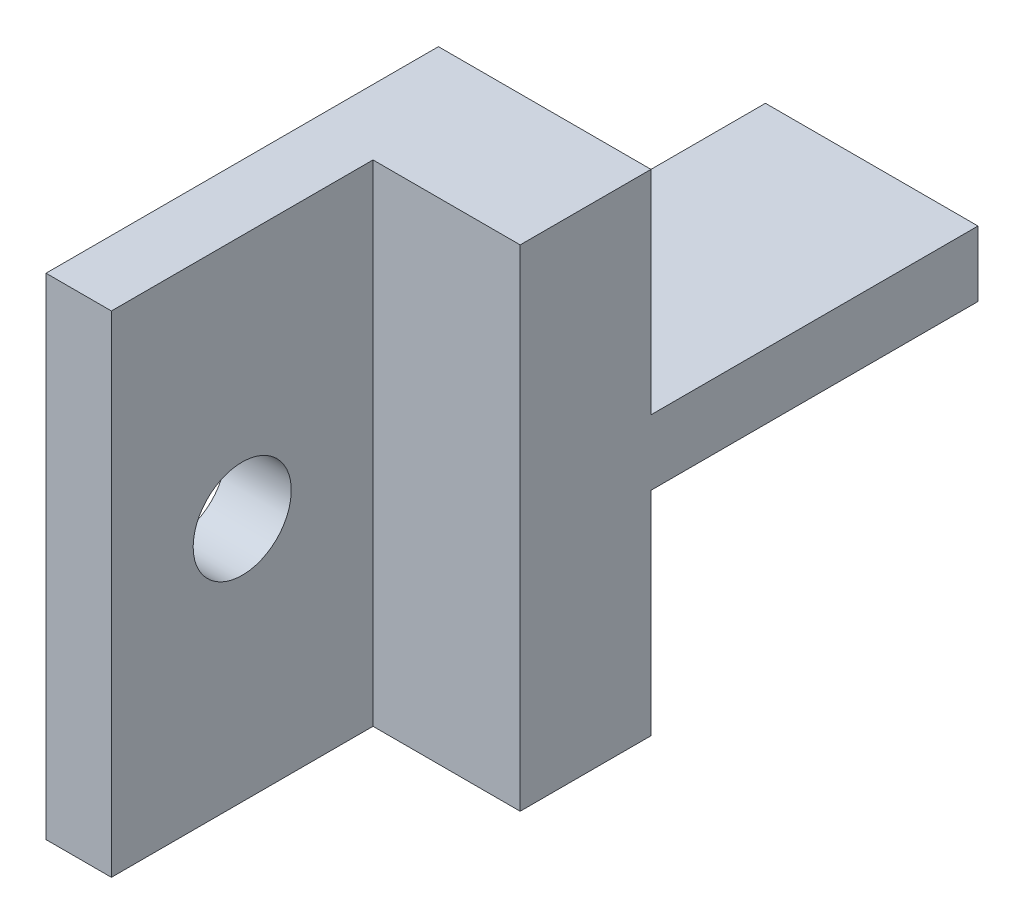
ISO-10303-21;
HEADER;
FILE_DESCRIPTION(('STEP AP214'),'2;1');
FILE_NAME('part.step','',(''),(''),'','','');
FILE_SCHEMA(('AUTOMOTIVE_DESIGN { 1 0 10303 214 1 1 1 1 }'));
ENDSEC;
DATA;
#1=APPLICATION_CONTEXT('core data for automotive mechanical design processes');
#2=APPLICATION_PROTOCOL_DEFINITION('international standard','automotive_design',2000,#1);
#3=PRODUCT_CONTEXT('',#1,'mechanical');
#4=PRODUCT('Part','Part','',(#3));
#5=PRODUCT_RELATED_PRODUCT_CATEGORY('part','',(#4));
#6=PRODUCT_DEFINITION_FORMATION('','',#4);
#7=PRODUCT_DEFINITION_CONTEXT('part definition',#1,'design');
#8=PRODUCT_DEFINITION('design','',#6,#7);
#9=PRODUCT_DEFINITION_SHAPE('','',#8);
#10=(LENGTH_UNIT() NAMED_UNIT(*) SI_UNIT(.MILLI.,.METRE.));
#11=(NAMED_UNIT(*) PLANE_ANGLE_UNIT() SI_UNIT($,.RADIAN.));
#12=(NAMED_UNIT(*) SI_UNIT($,.STERADIAN.) SOLID_ANGLE_UNIT());
#13=UNCERTAINTY_MEASURE_WITH_UNIT(LENGTH_MEASURE(1.E-05),#10,'distance_accuracy_value','');
#14=(GEOMETRIC_REPRESENTATION_CONTEXT(3) GLOBAL_UNCERTAINTY_ASSIGNED_CONTEXT((#13)) GLOBAL_UNIT_ASSIGNED_CONTEXT((#10,
#11,#12)) REPRESENTATION_CONTEXT('',''));
#15=CARTESIAN_POINT('',(0.,0.,0.));
#16=DIRECTION('',(0.,0.,1.));
#17=DIRECTION('',(1.,0.,0.));
#18=AXIS2_PLACEMENT_3D('',#15,#16,#17);
#19=CARTESIAN_POINT('',(0.,0.,-34.));
#20=DIRECTION('',(0.,0.,1.));
#21=DIRECTION('',(1.,0.,0.));
#22=AXIS2_PLACEMENT_3D('',#19,#20,#21);
#23=PLANE('',#22);
#24=DIRECTION('',(1.,0.,0.));
#25=VECTOR('',#24,1.);
#26=CARTESIAN_POINT('',(6.5,8.5,-34.));
#27=LINE('',#26,#25);
#28=CARTESIAN_POINT('',(0.,8.5,-34.));
#29=VERTEX_POINT('',#28);
#30=CARTESIAN_POINT('',(6.5,8.5,-34.));
#31=VERTEX_POINT('',#30);
#32=EDGE_CURVE('E170',#29,#31,#27,.T.);
#33=ORIENTED_EDGE('',*,*,#32,.F.);
#34=DIRECTION('',(0.,1.,0.));
#35=VECTOR('',#34,1.);
#36=CARTESIAN_POINT('',(0.,15.,-34.));
#37=LINE('',#36,#35);
#38=CARTESIAN_POINT('',(0.,15.,-34.));
#39=VERTEX_POINT('',#38);
#40=EDGE_CURVE('E146',#29,#39,#37,.T.);
#41=ORIENTED_EDGE('',*,*,#40,.T.);
#42=DIRECTION('',(1.,0.,0.));
#43=VECTOR('',#42,1.);
#44=CARTESIAN_POINT('',(0.,15.,-34.));
#45=LINE('',#44,#43);
#46=CARTESIAN_POINT('',(6.5,15.,-34.));
#47=VERTEX_POINT('',#46);
#48=EDGE_CURVE('E156',#39,#47,#45,.T.);
#49=ORIENTED_EDGE('',*,*,#48,.T.);
#50=DIRECTION('',(0.,-1.,0.));
#51=VECTOR('',#50,1.);
#52=CARTESIAN_POINT('',(6.5,15.,-34.));
#53=LINE('',#52,#51);
#54=EDGE_CURVE('E153',#47,#31,#53,.T.);
#55=ORIENTED_EDGE('',*,*,#54,.T.);
#56=EDGE_LOOP('',(#33,#41,#49,#55));
#57=FACE_BOUND('',#56,.T.);
#58=ADVANCED_FACE('F33',(#57),#23,.F.);
#59=DIRECTION('',(-1.,0.,0.));
#60=VECTOR('',#59,1.);
#61=CARTESIAN_POINT('',(6.5,6.5,-34.));
#62=LINE('',#61,#60);
#63=CARTESIAN_POINT('',(6.5,6.5,-34.));
#64=VERTEX_POINT('',#63);
#65=CARTESIAN_POINT('',(0.,6.5,-34.));
#66=VERTEX_POINT('',#65);
#67=EDGE_CURVE('E58',#64,#66,#62,.T.);
#68=ORIENTED_EDGE('',*,*,#67,.F.);
#69=CARTESIAN_POINT('',(6.5,0.,-34.));
#70=VERTEX_POINT('',#69);
#71=EDGE_CURVE('E155',#64,#70,#53,.T.);
#72=ORIENTED_EDGE('',*,*,#71,.T.);
#73=DIRECTION('',(-1.,0.,0.));
#74=VECTOR('',#73,1.);
#75=CARTESIAN_POINT('',(0.,0.,-34.));
#76=LINE('',#75,#74);
#77=CARTESIAN_POINT('',(0.,0.,-34.));
#78=VERTEX_POINT('',#77);
#79=EDGE_CURVE('E143',#70,#78,#76,.T.);
#80=ORIENTED_EDGE('',*,*,#79,.T.);
#81=EDGE_CURVE('E132',#78,#66,#37,.T.);
#82=ORIENTED_EDGE('',*,*,#81,.T.);
#83=EDGE_LOOP('',(#68,#72,#80,#82));
#84=FACE_BOUND('',#83,.T.);
#85=ADVANCED_FACE('F209',(#84),#23,.F.);
#86=CARTESIAN_POINT('',(2.,0.,0.));
#87=DIRECTION('',(0.,1.,0.));
#88=DIRECTION('',(0.,0.,1.));
#89=AXIS2_PLACEMENT_3D('',#86,#87,#88);
#90=PLANE('',#89);
#91=DIRECTION('',(0.,0.,-1.));
#92=VECTOR('',#91,1.);
#93=CARTESIAN_POINT('',(2.,0.,0.));
#94=LINE('',#93,#92);
#95=CARTESIAN_POINT('',(2.,0.,-22.));
#96=VERTEX_POINT('',#95);
#97=CARTESIAN_POINT('',(2.,0.,-30.));
#98=VERTEX_POINT('',#97);
#99=EDGE_CURVE('E126',#96,#98,#94,.T.);
#100=ORIENTED_EDGE('',*,*,#99,.F.);
#101=DIRECTION('',(-1.,0.,0.));
#102=VECTOR('',#101,1.);
#103=CARTESIAN_POINT('',(10.,0.,-22.));
#104=LINE('',#103,#102);
#105=CARTESIAN_POINT('',(0.,0.,-22.));
#106=VERTEX_POINT('',#105);
#107=EDGE_CURVE('E112',#96,#106,#104,.T.);
#108=ORIENTED_EDGE('',*,*,#107,.T.);
#109=DIRECTION('',(0.,0.,-1.));
#110=VECTOR('',#109,1.);
#111=CARTESIAN_POINT('',(0.,0.,0.));
#112=LINE('',#111,#110);
#113=EDGE_CURVE('E123',#106,#78,#112,.T.);
#114=ORIENTED_EDGE('',*,*,#113,.T.);
#115=ORIENTED_EDGE('',*,*,#79,.F.);
#116=DIRECTION('',(0.,0.,1.));
#117=VECTOR('',#116,1.);
#118=CARTESIAN_POINT('',(6.5,0.,-34.));
#119=LINE('',#118,#117);
#120=CARTESIAN_POINT('',(6.5,0.,-30.));
#121=VERTEX_POINT('',#120);
#122=EDGE_CURVE('E135',#70,#121,#119,.T.);
#123=ORIENTED_EDGE('',*,*,#122,.T.);
#124=DIRECTION('',(-1.,0.,0.));
#125=VECTOR('',#124,1.);
#126=CARTESIAN_POINT('',(0.,0.,-30.));
#127=LINE('',#126,#125);
#128=EDGE_CURVE('E144',#121,#98,#127,.T.);
#129=ORIENTED_EDGE('',*,*,#128,.T.);
#130=EDGE_LOOP('',(#100,#108,#114,#115,#123,#129));
#131=FACE_BOUND('',#130,.T.);
#132=ADVANCED_FACE('F35',(#131),#90,.F.);
#133=CARTESIAN_POINT('',(2.,15.,0.));
#134=DIRECTION('',(0.,-1.,0.));
#135=DIRECTION('',(0.,0.,-1.));
#136=AXIS2_PLACEMENT_3D('',#133,#134,#135);
#137=PLANE('',#136);
#138=DIRECTION('',(0.,0.,1.));
#139=VECTOR('',#138,1.);
#140=CARTESIAN_POINT('',(0.,15.,0.));
#141=LINE('',#140,#139);
#142=CARTESIAN_POINT('',(0.,15.,-22.));
#143=VERTEX_POINT('',#142);
#144=EDGE_CURVE('E37',#39,#143,#141,.T.);
#145=ORIENTED_EDGE('',*,*,#144,.T.);
#146=DIRECTION('',(-1.,0.,0.));
#147=VECTOR('',#146,1.);
#148=CARTESIAN_POINT('',(10.,15.,-22.));
#149=LINE('',#148,#147);
#150=CARTESIAN_POINT('',(2.,15.,-22.));
#151=VERTEX_POINT('',#150);
#152=EDGE_CURVE('E50',#151,#143,#149,.T.);
#153=ORIENTED_EDGE('',*,*,#152,.F.);
#154=DIRECTION('',(0.,0.,1.));
#155=VECTOR('',#154,1.);
#156=CARTESIAN_POINT('',(2.,15.,0.));
#157=LINE('',#156,#155);
#158=CARTESIAN_POINT('',(2.,15.,-30.));
#159=VERTEX_POINT('',#158);
#160=EDGE_CURVE('E11',#159,#151,#157,.T.);
#161=ORIENTED_EDGE('',*,*,#160,.F.);
#162=DIRECTION('',(1.,0.,0.));
#163=VECTOR('',#162,1.);
#164=CARTESIAN_POINT('',(0.,15.,-30.));
#165=LINE('',#164,#163);
#166=CARTESIAN_POINT('',(6.5,15.,-30.));
#167=VERTEX_POINT('',#166);
#168=EDGE_CURVE('E149',#159,#167,#165,.T.);
#169=ORIENTED_EDGE('',*,*,#168,.T.);
#170=DIRECTION('',(0.,0.,1.));
#171=VECTOR('',#170,1.);
#172=CARTESIAN_POINT('',(6.5,15.,-34.));
#173=LINE('',#172,#171);
#174=EDGE_CURVE('E133',#47,#167,#173,.T.);
#175=ORIENTED_EDGE('',*,*,#174,.F.);
#176=ORIENTED_EDGE('',*,*,#48,.F.);
#177=EDGE_LOOP('',(#145,#153,#161,#169,#175,#176));
#178=FACE_BOUND('',#177,.T.);
#179=ADVANCED_FACE('F205',(#178),#137,.F.);
#180=CARTESIAN_POINT('',(2.,0.,0.));
#181=DIRECTION('',(-1.,0.,0.));
#182=DIRECTION('',(0.,0.,1.));
#183=AXIS2_PLACEMENT_3D('',#180,#181,#182);
#184=PLANE('',#183);
#185=CARTESIAN_POINT('',(2.,7.5,-26.));
#186=DIRECTION('',(-1.,0.,0.));
#187=DIRECTION('',(0.,0.,1.));
#188=AXIS2_PLACEMENT_3D('',#185,#186,#187);
#189=CIRCLE('',#188,1.5);
#190=CARTESIAN_POINT('',(2.,7.5,-24.5));
#191=VERTEX_POINT('',#190);
#192=EDGE_CURVE('E118',#191,#191,#189,.T.);
#193=ORIENTED_EDGE('',*,*,#192,.T.);
#194=EDGE_LOOP('',(#193));
#195=FACE_BOUND('',#194,.T.);
#196=ORIENTED_EDGE('',*,*,#160,.T.);
#197=DIRECTION('',(0.,-1.,0.));
#198=VECTOR('',#197,1.);
#199=CARTESIAN_POINT('',(2.,0.,-22.));
#200=LINE('',#199,#198);
#201=EDGE_CURVE('E127',#151,#96,#200,.T.);
#202=ORIENTED_EDGE('',*,*,#201,.T.);
#203=ORIENTED_EDGE('',*,*,#99,.T.);
#204=DIRECTION('',(0.,1.,0.));
#205=VECTOR('',#204,1.);
#206=CARTESIAN_POINT('',(2.,0.,-30.));
#207=LINE('',#206,#205);
#208=EDGE_CURVE('E42',#98,#159,#207,.T.);
#209=ORIENTED_EDGE('',*,*,#208,.T.);
#210=EDGE_LOOP('',(#196,#202,#203,#209));
#211=FACE_BOUND('',#210,.T.);
#212=ADVANCED_FACE('F195',(#195,#211),#184,.F.);
#213=CARTESIAN_POINT('',(0.,0.,0.));
#214=DIRECTION('',(-1.,0.,0.));
#215=DIRECTION('',(0.,0.,1.));
#216=AXIS2_PLACEMENT_3D('',#213,#214,#215);
#217=PLANE('',#216);
#218=CARTESIAN_POINT('',(0.,7.5,-26.));
#219=DIRECTION('',(-1.,0.,0.));
#220=DIRECTION('',(0.,0.,1.));
#221=AXIS2_PLACEMENT_3D('',#218,#219,#220);
#222=CIRCLE('',#221,1.5);
#223=CARTESIAN_POINT('',(0.,7.5,-24.5));
#224=VERTEX_POINT('',#223);
#225=EDGE_CURVE('E186',#224,#224,#222,.T.);
#226=ORIENTED_EDGE('',*,*,#225,.F.);
#227=EDGE_LOOP('',(#226));
#228=FACE_BOUND('',#227,.T.);
#229=DIRECTION('',(0.,-1.,0.));
#230=VECTOR('',#229,1.);
#231=CARTESIAN_POINT('',(0.,15.,-22.));
#232=LINE('',#231,#230);
#233=EDGE_CURVE('E109',#143,#106,#232,.T.);
#234=ORIENTED_EDGE('',*,*,#233,.F.);
#235=ORIENTED_EDGE('',*,*,#144,.F.);
#236=ORIENTED_EDGE('',*,*,#40,.F.);
#237=DIRECTION('',(0.,0.,1.));
#238=VECTOR('',#237,1.);
#239=CARTESIAN_POINT('',(0.,8.5,-44.));
#240=LINE('',#239,#238);
#241=CARTESIAN_POINT('',(0.,8.5,-44.));
#242=VERTEX_POINT('',#241);
#243=EDGE_CURVE('E163',#242,#29,#240,.T.);
#244=ORIENTED_EDGE('',*,*,#243,.F.);
#245=DIRECTION('',(0.,1.,0.));
#246=VECTOR('',#245,1.);
#247=CARTESIAN_POINT('',(0.,8.5,-44.));
#248=LINE('',#247,#246);
#249=CARTESIAN_POINT('',(0.,6.5,-44.));
#250=VERTEX_POINT('',#249);
#251=EDGE_CURVE('E176',#250,#242,#248,.T.);
#252=ORIENTED_EDGE('',*,*,#251,.F.);
#253=DIRECTION('',(0.,0.,1.));
#254=VECTOR('',#253,1.);
#255=CARTESIAN_POINT('',(0.,6.5,-44.));
#256=LINE('',#255,#254);
#257=EDGE_CURVE('E161',#250,#66,#256,.T.);
#258=ORIENTED_EDGE('',*,*,#257,.T.);
#259=ORIENTED_EDGE('',*,*,#81,.F.);
#260=ORIENTED_EDGE('',*,*,#113,.F.);
#261=EDGE_LOOP('',(#234,#235,#236,#244,#252,#258,#259,#260));
#262=FACE_BOUND('',#261,.T.);
#263=ADVANCED_FACE('F130',(#228,#262),#217,.T.);
#264=CARTESIAN_POINT('',(0.,0.,-30.));
#265=DIRECTION('',(0.,0.,1.));
#266=DIRECTION('',(1.,0.,0.));
#267=AXIS2_PLACEMENT_3D('',#264,#265,#266);
#268=PLANE('',#267);
#269=ORIENTED_EDGE('',*,*,#208,.F.);
#270=ORIENTED_EDGE('',*,*,#128,.F.);
#271=DIRECTION('',(0.,-1.,0.));
#272=VECTOR('',#271,1.);
#273=CARTESIAN_POINT('',(6.5,15.,-30.));
#274=LINE('',#273,#272);
#275=EDGE_CURVE('E147',#167,#121,#274,.T.);
#276=ORIENTED_EDGE('',*,*,#275,.F.);
#277=ORIENTED_EDGE('',*,*,#168,.F.);
#278=EDGE_LOOP('',(#269,#270,#276,#277));
#279=FACE_BOUND('',#278,.T.);
#280=ADVANCED_FACE('F194',(#279),#268,.T.);
#281=CARTESIAN_POINT('',(6.5,15.,-34.));
#282=DIRECTION('',(-1.,0.,0.));
#283=DIRECTION('',(0.,-1.,0.));
#284=AXIS2_PLACEMENT_3D('',#281,#282,#283);
#285=PLANE('',#284);
#286=ORIENTED_EDGE('',*,*,#275,.T.);
#287=ORIENTED_EDGE('',*,*,#122,.F.);
#288=ORIENTED_EDGE('',*,*,#71,.F.);
#289=DIRECTION('',(0.,0.,1.));
#290=VECTOR('',#289,1.);
#291=CARTESIAN_POINT('',(6.5,6.5,-44.));
#292=LINE('',#291,#290);
#293=CARTESIAN_POINT('',(6.5,6.5,-44.));
#294=VERTEX_POINT('',#293);
#295=EDGE_CURVE('E151',#294,#64,#292,.T.);
#296=ORIENTED_EDGE('',*,*,#295,.F.);
#297=DIRECTION('',(0.,-1.,0.));
#298=VECTOR('',#297,1.);
#299=CARTESIAN_POINT('',(6.5,8.5,-44.));
#300=LINE('',#299,#298);
#301=CARTESIAN_POINT('',(6.5,8.5,-44.));
#302=VERTEX_POINT('',#301);
#303=EDGE_CURVE('E173',#302,#294,#300,.T.);
#304=ORIENTED_EDGE('',*,*,#303,.F.);
#305=DIRECTION('',(0.,0.,1.));
#306=VECTOR('',#305,1.);
#307=CARTESIAN_POINT('',(6.5,8.5,-44.));
#308=LINE('',#307,#306);
#309=EDGE_CURVE('E166',#302,#31,#308,.T.);
#310=ORIENTED_EDGE('',*,*,#309,.T.);
#311=ORIENTED_EDGE('',*,*,#54,.F.);
#312=ORIENTED_EDGE('',*,*,#174,.T.);
#313=EDGE_LOOP('',(#286,#287,#288,#296,#304,#310,#311,#312));
#314=FACE_BOUND('',#313,.T.);
#315=ADVANCED_FACE('F202',(#314),#285,.F.);
#316=CARTESIAN_POINT('',(6.5,6.5,-44.));
#317=DIRECTION('',(0.,1.,0.));
#318=DIRECTION('',(0.,0.,1.));
#319=AXIS2_PLACEMENT_3D('',#316,#317,#318);
#320=PLANE('',#319);
#321=ORIENTED_EDGE('',*,*,#67,.T.);
#322=ORIENTED_EDGE('',*,*,#257,.F.);
#323=DIRECTION('',(-1.,0.,0.));
#324=VECTOR('',#323,1.);
#325=CARTESIAN_POINT('',(6.5,6.5,-44.));
#326=LINE('',#325,#324);
#327=EDGE_CURVE('E178',#294,#250,#326,.T.);
#328=ORIENTED_EDGE('',*,*,#327,.F.);
#329=ORIENTED_EDGE('',*,*,#295,.T.);
#330=EDGE_LOOP('',(#321,#322,#328,#329));
#331=FACE_BOUND('',#330,.T.);
#332=ADVANCED_FACE('F216',(#331),#320,.F.);
#333=CARTESIAN_POINT('',(6.5,8.5,-44.));
#334=DIRECTION('',(0.,-1.,0.));
#335=DIRECTION('',(1.,0.,0.));
#336=AXIS2_PLACEMENT_3D('',#333,#334,#335);
#337=PLANE('',#336);
#338=ORIENTED_EDGE('',*,*,#32,.T.);
#339=ORIENTED_EDGE('',*,*,#309,.F.);
#340=DIRECTION('',(1.,0.,0.));
#341=VECTOR('',#340,1.);
#342=CARTESIAN_POINT('',(6.5,8.5,-44.));
#343=LINE('',#342,#341);
#344=EDGE_CURVE('E169',#242,#302,#343,.T.);
#345=ORIENTED_EDGE('',*,*,#344,.F.);
#346=ORIENTED_EDGE('',*,*,#243,.T.);
#347=EDGE_LOOP('',(#338,#339,#345,#346));
#348=FACE_BOUND('',#347,.T.);
#349=ADVANCED_FACE('F224',(#348),#337,.F.);
#350=CARTESIAN_POINT('',(0.,0.,-44.));
#351=DIRECTION('',(0.,0.,-1.));
#352=DIRECTION('',(-1.,0.,0.));
#353=AXIS2_PLACEMENT_3D('',#350,#351,#352);
#354=PLANE('',#353);
#355=ORIENTED_EDGE('',*,*,#303,.T.);
#356=ORIENTED_EDGE('',*,*,#327,.T.);
#357=ORIENTED_EDGE('',*,*,#251,.T.);
#358=ORIENTED_EDGE('',*,*,#344,.T.);
#359=EDGE_LOOP('',(#355,#356,#357,#358));
#360=FACE_BOUND('',#359,.T.);
#361=ADVANCED_FACE('F244',(#360),#354,.T.);
#362=CARTESIAN_POINT('',(10.,15.,-22.));
#363=DIRECTION('',(0.,0.,-1.));
#364=DIRECTION('',(0.,1.,0.));
#365=AXIS2_PLACEMENT_3D('',#362,#363,#364);
#366=PLANE('',#365);
#367=ORIENTED_EDGE('',*,*,#152,.T.);
#368=ORIENTED_EDGE('',*,*,#233,.T.);
#369=ORIENTED_EDGE('',*,*,#107,.F.);
#370=ORIENTED_EDGE('',*,*,#201,.F.);
#371=EDGE_LOOP('',(#367,#368,#369,#370));
#372=FACE_BOUND('',#371,.T.);
#373=ADVANCED_FACE('F111',(#372),#366,.F.);
#374=CARTESIAN_POINT('',(10.,7.5,-26.));
#375=DIRECTION('',(-1.,0.,0.));
#376=DIRECTION('',(0.,0.,1.));
#377=AXIS2_PLACEMENT_3D('',#374,#375,#376);
#378=CYLINDRICAL_SURFACE('',#377,1.5);
#379=ORIENTED_EDGE('',*,*,#225,.T.);
#380=EDGE_LOOP('',(#379));
#381=FACE_BOUND('',#380,.T.);
#382=ORIENTED_EDGE('',*,*,#192,.F.);
#383=EDGE_LOOP('',(#382));
#384=FACE_BOUND('',#383,.T.);
#385=ADVANCED_FACE('F190',(#381,#384),#378,.F.);
#386=CLOSED_SHELL('',(#58,#85,#132,#179,#212,#263,#280,#315,#332,#349,#361,#373,#385));
#387=MANIFOLD_SOLID_BREP('B2',#386);
#388=ADVANCED_BREP_SHAPE_REPRESENTATION('',(#18,#387),#14);
#389=SHAPE_DEFINITION_REPRESENTATION(#9,#388);
ENDSEC;
END-ISO-10303-21;
